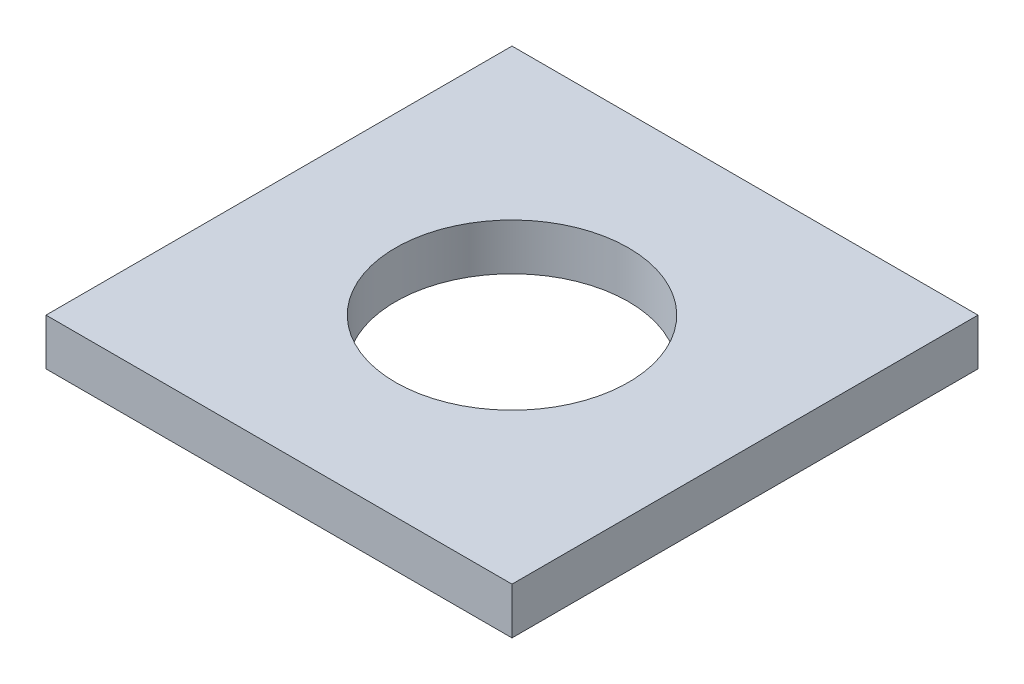
ISO-10303-21;
HEADER;
FILE_DESCRIPTION(('STEP AP214'),'2;1');
FILE_NAME('part.step','',(''),(''),'','','');
FILE_SCHEMA(('AUTOMOTIVE_DESIGN { 1 0 10303 214 1 1 1 1 }'));
ENDSEC;
DATA;
#1=APPLICATION_CONTEXT('core data for automotive mechanical design processes');
#2=APPLICATION_PROTOCOL_DEFINITION('international standard','automotive_design',2000,#1);
#3=PRODUCT_CONTEXT('',#1,'mechanical');
#4=PRODUCT('Part','Part','',(#3));
#5=PRODUCT_RELATED_PRODUCT_CATEGORY('part','',(#4));
#6=PRODUCT_DEFINITION_FORMATION('','',#4);
#7=PRODUCT_DEFINITION_CONTEXT('part definition',#1,'design');
#8=PRODUCT_DEFINITION('design','',#6,#7);
#9=PRODUCT_DEFINITION_SHAPE('','',#8);
#10=(LENGTH_UNIT() NAMED_UNIT(*) SI_UNIT(.MILLI.,.METRE.));
#11=(NAMED_UNIT(*) PLANE_ANGLE_UNIT() SI_UNIT($,.RADIAN.));
#12=(NAMED_UNIT(*) SI_UNIT($,.STERADIAN.) SOLID_ANGLE_UNIT());
#13=UNCERTAINTY_MEASURE_WITH_UNIT(LENGTH_MEASURE(1.E-05),#10,'distance_accuracy_value','');
#14=(GEOMETRIC_REPRESENTATION_CONTEXT(3) GLOBAL_UNCERTAINTY_ASSIGNED_CONTEXT((#13)) GLOBAL_UNIT_ASSIGNED_CONTEXT((#10,
#11,#12)) REPRESENTATION_CONTEXT('',''));
#15=CARTESIAN_POINT('',(0.,0.,0.));
#16=DIRECTION('',(0.,0.,1.));
#17=DIRECTION('',(1.,0.,0.));
#18=AXIS2_PLACEMENT_3D('',#15,#16,#17);
#19=CARTESIAN_POINT('',(0.,0.8,0.));
#20=DIRECTION('',(0.,-1.,0.));
#21=DIRECTION('',(0.,0.,-1.));
#22=AXIS2_PLACEMENT_3D('',#19,#20,#21);
#23=PLANE('',#22);
#24=DIRECTION('',(0.,0.,-1.));
#25=VECTOR('',#24,1.);
#26=CARTESIAN_POINT('',(4.,0.8,4.));
#27=LINE('',#26,#25);
#28=CARTESIAN_POINT('',(4.,0.8,4.));
#29=VERTEX_POINT('',#28);
#30=CARTESIAN_POINT('',(4.,0.8,-4.));
#31=VERTEX_POINT('',#30);
#32=EDGE_CURVE('E85',#29,#31,#27,.T.);
#33=ORIENTED_EDGE('',*,*,#32,.T.);
#34=DIRECTION('',(-1.,0.,0.));
#35=VECTOR('',#34,1.);
#36=CARTESIAN_POINT('',(-4.,0.8,-4.));
#37=LINE('',#36,#35);
#38=CARTESIAN_POINT('',(-4.,0.8,-4.));
#39=VERTEX_POINT('',#38);
#40=EDGE_CURVE('E80',#31,#39,#37,.T.);
#41=ORIENTED_EDGE('',*,*,#40,.T.);
#42=DIRECTION('',(0.,0.,1.));
#43=VECTOR('',#42,1.);
#44=CARTESIAN_POINT('',(-4.,0.8,4.));
#45=LINE('',#44,#43);
#46=CARTESIAN_POINT('',(-4.,0.8,4.));
#47=VERTEX_POINT('',#46);
#48=EDGE_CURVE('E83',#39,#47,#45,.T.);
#49=ORIENTED_EDGE('',*,*,#48,.T.);
#50=DIRECTION('',(1.,0.,0.));
#51=VECTOR('',#50,1.);
#52=CARTESIAN_POINT('',(-4.,0.8,4.));
#53=LINE('',#52,#51);
#54=EDGE_CURVE('E50',#47,#29,#53,.T.);
#55=ORIENTED_EDGE('',*,*,#54,.T.);
#56=EDGE_LOOP('',(#33,#41,#49,#55));
#57=FACE_BOUND('',#56,.T.);
#58=CARTESIAN_POINT('',(0.,0.8,0.));
#59=DIRECTION('',(0.,1.,0.));
#60=DIRECTION('',(0.,0.,1.));
#61=AXIS2_PLACEMENT_3D('',#58,#59,#60);
#62=CIRCLE('',#61,2.);
#63=CARTESIAN_POINT('',(0.,0.8,2.));
#64=VERTEX_POINT('',#63);
#65=EDGE_CURVE('E100',#64,#64,#62,.T.);
#66=ORIENTED_EDGE('',*,*,#65,.F.);
#67=EDGE_LOOP('',(#66));
#68=FACE_BOUND('',#67,.T.);
#69=ADVANCED_FACE('F33',(#57,#68),#23,.F.);
#70=CARTESIAN_POINT('',(0.,0.,0.));
#71=DIRECTION('',(0.,-1.,0.));
#72=DIRECTION('',(0.,0.,-1.));
#73=AXIS2_PLACEMENT_3D('',#70,#71,#72);
#74=PLANE('',#73);
#75=DIRECTION('',(0.,0.,-1.));
#76=VECTOR('',#75,1.);
#77=CARTESIAN_POINT('',(4.,0.,4.));
#78=LINE('',#77,#76);
#79=CARTESIAN_POINT('',(4.,0.,4.));
#80=VERTEX_POINT('',#79);
#81=CARTESIAN_POINT('',(4.,0.,-4.));
#82=VERTEX_POINT('',#81);
#83=EDGE_CURVE('E97',#80,#82,#78,.T.);
#84=ORIENTED_EDGE('',*,*,#83,.F.);
#85=DIRECTION('',(1.,0.,0.));
#86=VECTOR('',#85,1.);
#87=CARTESIAN_POINT('',(-4.,0.,4.));
#88=LINE('',#87,#86);
#89=CARTESIAN_POINT('',(-4.,0.,4.));
#90=VERTEX_POINT('',#89);
#91=EDGE_CURVE('E73',#90,#80,#88,.T.);
#92=ORIENTED_EDGE('',*,*,#91,.F.);
#93=DIRECTION('',(0.,0.,1.));
#94=VECTOR('',#93,1.);
#95=CARTESIAN_POINT('',(-4.,0.,4.));
#96=LINE('',#95,#94);
#97=CARTESIAN_POINT('',(-4.,0.,-4.));
#98=VERTEX_POINT('',#97);
#99=EDGE_CURVE('E67',#98,#90,#96,.T.);
#100=ORIENTED_EDGE('',*,*,#99,.F.);
#101=DIRECTION('',(-1.,0.,0.));
#102=VECTOR('',#101,1.);
#103=CARTESIAN_POINT('',(-4.,0.,-4.));
#104=LINE('',#103,#102);
#105=EDGE_CURVE('E89',#82,#98,#104,.T.);
#106=ORIENTED_EDGE('',*,*,#105,.F.);
#107=EDGE_LOOP('',(#84,#92,#100,#106));
#108=FACE_BOUND('',#107,.T.);
#109=CARTESIAN_POINT('',(0.,0.,0.));
#110=DIRECTION('',(0.,1.,0.));
#111=DIRECTION('',(0.,0.,1.));
#112=AXIS2_PLACEMENT_3D('',#109,#110,#111);
#113=CIRCLE('',#112,2.);
#114=CARTESIAN_POINT('',(0.,0.,2.));
#115=VERTEX_POINT('',#114);
#116=EDGE_CURVE('E112',#115,#115,#113,.T.);
#117=ORIENTED_EDGE('',*,*,#116,.T.);
#118=EDGE_LOOP('',(#117));
#119=FACE_BOUND('',#118,.T.);
#120=ADVANCED_FACE('F108',(#108,#119),#74,.T.);
#121=CARTESIAN_POINT('',(4.,0.8,4.));
#122=DIRECTION('',(-1.,0.,0.));
#123=DIRECTION('',(0.,0.,1.));
#124=AXIS2_PLACEMENT_3D('',#121,#122,#123);
#125=PLANE('',#124);
#126=ORIENTED_EDGE('',*,*,#83,.T.);
#127=DIRECTION('',(0.,-1.,0.));
#128=VECTOR('',#127,1.);
#129=CARTESIAN_POINT('',(4.,0.8,-4.));
#130=LINE('',#129,#128);
#131=EDGE_CURVE('E11',#31,#82,#130,.T.);
#132=ORIENTED_EDGE('',*,*,#131,.F.);
#133=ORIENTED_EDGE('',*,*,#32,.F.);
#134=DIRECTION('',(0.,-1.,0.));
#135=VECTOR('',#134,1.);
#136=CARTESIAN_POINT('',(4.,0.8,4.));
#137=LINE('',#136,#135);
#138=EDGE_CURVE('E93',#29,#80,#137,.T.);
#139=ORIENTED_EDGE('',*,*,#138,.T.);
#140=EDGE_LOOP('',(#126,#132,#133,#139));
#141=FACE_BOUND('',#140,.T.);
#142=ADVANCED_FACE('F35',(#141),#125,.F.);
#143=CARTESIAN_POINT('',(-4.,0.8,-4.));
#144=DIRECTION('',(0.,0.,1.));
#145=DIRECTION('',(1.,0.,0.));
#146=AXIS2_PLACEMENT_3D('',#143,#144,#145);
#147=PLANE('',#146);
#148=ORIENTED_EDGE('',*,*,#105,.T.);
#149=DIRECTION('',(0.,-1.,0.));
#150=VECTOR('',#149,1.);
#151=CARTESIAN_POINT('',(-4.,0.8,-4.));
#152=LINE('',#151,#150);
#153=EDGE_CURVE('E42',#39,#98,#152,.T.);
#154=ORIENTED_EDGE('',*,*,#153,.F.);
#155=ORIENTED_EDGE('',*,*,#40,.F.);
#156=ORIENTED_EDGE('',*,*,#131,.T.);
#157=EDGE_LOOP('',(#148,#154,#155,#156));
#158=FACE_BOUND('',#157,.T.);
#159=ADVANCED_FACE('F88',(#158),#147,.F.);
#160=CARTESIAN_POINT('',(-4.,0.8,4.));
#161=DIRECTION('',(1.,0.,0.));
#162=DIRECTION('',(0.,0.,-1.));
#163=AXIS2_PLACEMENT_3D('',#160,#161,#162);
#164=PLANE('',#163);
#165=ORIENTED_EDGE('',*,*,#99,.T.);
#166=DIRECTION('',(0.,-1.,0.));
#167=VECTOR('',#166,1.);
#168=CARTESIAN_POINT('',(-4.,0.8,4.));
#169=LINE('',#168,#167);
#170=EDGE_CURVE('E90',#47,#90,#169,.T.);
#171=ORIENTED_EDGE('',*,*,#170,.F.);
#172=ORIENTED_EDGE('',*,*,#48,.F.);
#173=ORIENTED_EDGE('',*,*,#153,.T.);
#174=EDGE_LOOP('',(#165,#171,#172,#173));
#175=FACE_BOUND('',#174,.T.);
#176=ADVANCED_FACE('F91',(#175),#164,.F.);
#177=CARTESIAN_POINT('',(-4.,0.8,4.));
#178=DIRECTION('',(0.,0.,-1.));
#179=DIRECTION('',(-1.,0.,0.));
#180=AXIS2_PLACEMENT_3D('',#177,#178,#179);
#181=PLANE('',#180);
#182=ORIENTED_EDGE('',*,*,#91,.T.);
#183=ORIENTED_EDGE('',*,*,#138,.F.);
#184=ORIENTED_EDGE('',*,*,#54,.F.);
#185=ORIENTED_EDGE('',*,*,#170,.T.);
#186=EDGE_LOOP('',(#182,#183,#184,#185));
#187=FACE_BOUND('',#186,.T.);
#188=ADVANCED_FACE('F105',(#187),#181,.F.);
#189=CARTESIAN_POINT('',(0.,0.8,0.));
#190=DIRECTION('',(0.,-1.,0.));
#191=DIRECTION('',(0.,0.,-1.));
#192=AXIS2_PLACEMENT_3D('',#189,#190,#191);
#193=CYLINDRICAL_SURFACE('',#192,2.);
#194=ORIENTED_EDGE('',*,*,#65,.T.);
#195=EDGE_LOOP('',(#194));
#196=FACE_BOUND('',#195,.T.);
#197=ORIENTED_EDGE('',*,*,#116,.F.);
#198=EDGE_LOOP('',(#197));
#199=FACE_BOUND('',#198,.T.);
#200=ADVANCED_FACE('F118',(#196,#199),#193,.F.);
#201=CLOSED_SHELL('',(#69,#120,#142,#159,#176,#188,#200));
#202=MANIFOLD_SOLID_BREP('B2',#201);
#203=ADVANCED_BREP_SHAPE_REPRESENTATION('',(#18,#202),#14);
#204=SHAPE_DEFINITION_REPRESENTATION(#9,#203);
ENDSEC;
END-ISO-10303-21;
